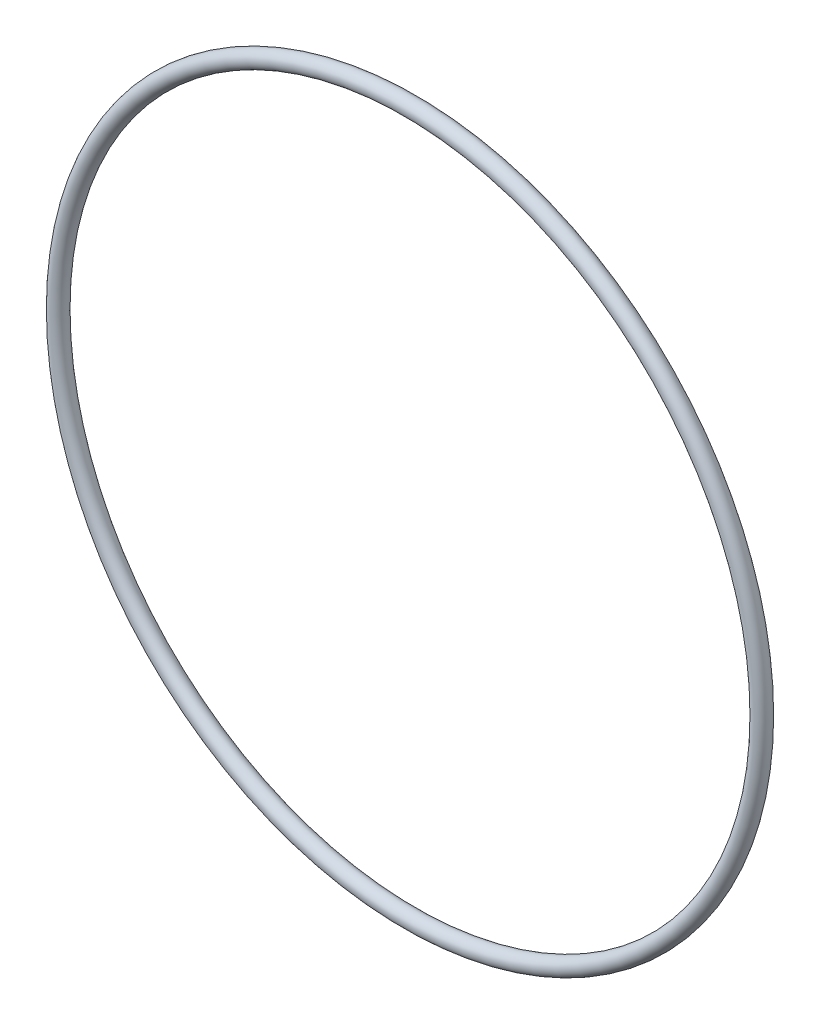
ISO-10303-21;
HEADER;
FILE_DESCRIPTION(('STEP AP214'),'2;1');
FILE_NAME('part.step','',(''),(''),'','','');
FILE_SCHEMA(('AUTOMOTIVE_DESIGN { 1 0 10303 214 1 1 1 1 }'));
ENDSEC;
DATA;
#1=APPLICATION_CONTEXT('core data for automotive mechanical design processes');
#2=APPLICATION_PROTOCOL_DEFINITION('international standard','automotive_design',2000,#1);
#3=PRODUCT_CONTEXT('',#1,'mechanical');
#4=PRODUCT('Part','Part','',(#3));
#5=PRODUCT_RELATED_PRODUCT_CATEGORY('part','',(#4));
#6=PRODUCT_DEFINITION_FORMATION('','',#4);
#7=PRODUCT_DEFINITION_CONTEXT('part definition',#1,'design');
#8=PRODUCT_DEFINITION('design','',#6,#7);
#9=PRODUCT_DEFINITION_SHAPE('','',#8);
#10=(LENGTH_UNIT() NAMED_UNIT(*) SI_UNIT(.MILLI.,.METRE.));
#11=(NAMED_UNIT(*) PLANE_ANGLE_UNIT() SI_UNIT($,.RADIAN.));
#12=(NAMED_UNIT(*) SI_UNIT($,.STERADIAN.) SOLID_ANGLE_UNIT());
#13=UNCERTAINTY_MEASURE_WITH_UNIT(LENGTH_MEASURE(1.E-05),#10,'distance_accuracy_value','');
#14=(GEOMETRIC_REPRESENTATION_CONTEXT(3) GLOBAL_UNCERTAINTY_ASSIGNED_CONTEXT((#13)) GLOBAL_UNIT_ASSIGNED_CONTEXT((#10,
#11,#12)) REPRESENTATION_CONTEXT('',''));
#15=CARTESIAN_POINT('',(0.,0.,0.));
#16=DIRECTION('',(0.,0.,1.));
#17=DIRECTION('',(1.,0.,0.));
#18=AXIS2_PLACEMENT_3D('',#15,#16,#17);
#19=CARTESIAN_POINT('',(0.,0.,0.));
#20=DIRECTION('',(0.,0.,1.));
#21=DIRECTION('',(1.,0.,0.));
#22=AXIS2_PLACEMENT_3D('',#19,#20,#21);
#23=TOROIDAL_SURFACE('',#22,55.,1.31);
#24=CARTESIAN_POINT('',(-55.,0.,0.));
#25=DIRECTION('',(0.,1.,0.));
#26=DIRECTION('',(0.,0.,1.));
#27=AXIS2_PLACEMENT_3D('',#24,#25,#26);
#28=CIRCLE('',#27,1.31);
#29=CARTESIAN_POINT('',(-56.31,0.,0.));
#30=VERTEX_POINT('',#29);
#31=EDGE_CURVE('E10',#30,#30,#28,.T.);
#32=CARTESIAN_POINT('',(0.,0.,0.));
#33=DIRECTION('',(0.,0.,1.));
#34=DIRECTION('',(1.,0.,0.));
#35=AXIS2_PLACEMENT_3D('',#32,#33,#34);
#36=CIRCLE('',#35,56.31);
#37=EDGE_CURVE('',#30,#30,#36,.T.);
#38=ORIENTED_EDGE('',*,*,#31,.F.);
#39=ORIENTED_EDGE('',*,*,#31,.T.);
#40=ORIENTED_EDGE('',*,*,#37,.T.);
#41=ORIENTED_EDGE('',*,*,#37,.F.);
#42=EDGE_LOOP('',(#38,#40,#39,#41));
#43=FACE_BOUND('',#42,.T.);
#44=ADVANCED_FACE('F41',(#43),#23,.T.);
#45=CLOSED_SHELL('',(#44));
#46=MANIFOLD_SOLID_BREP('B2',#45);
#47=ADVANCED_BREP_SHAPE_REPRESENTATION('',(#18,#46),#14);
#48=SHAPE_DEFINITION_REPRESENTATION(#9,#47);
ENDSEC;
END-ISO-10303-21;
